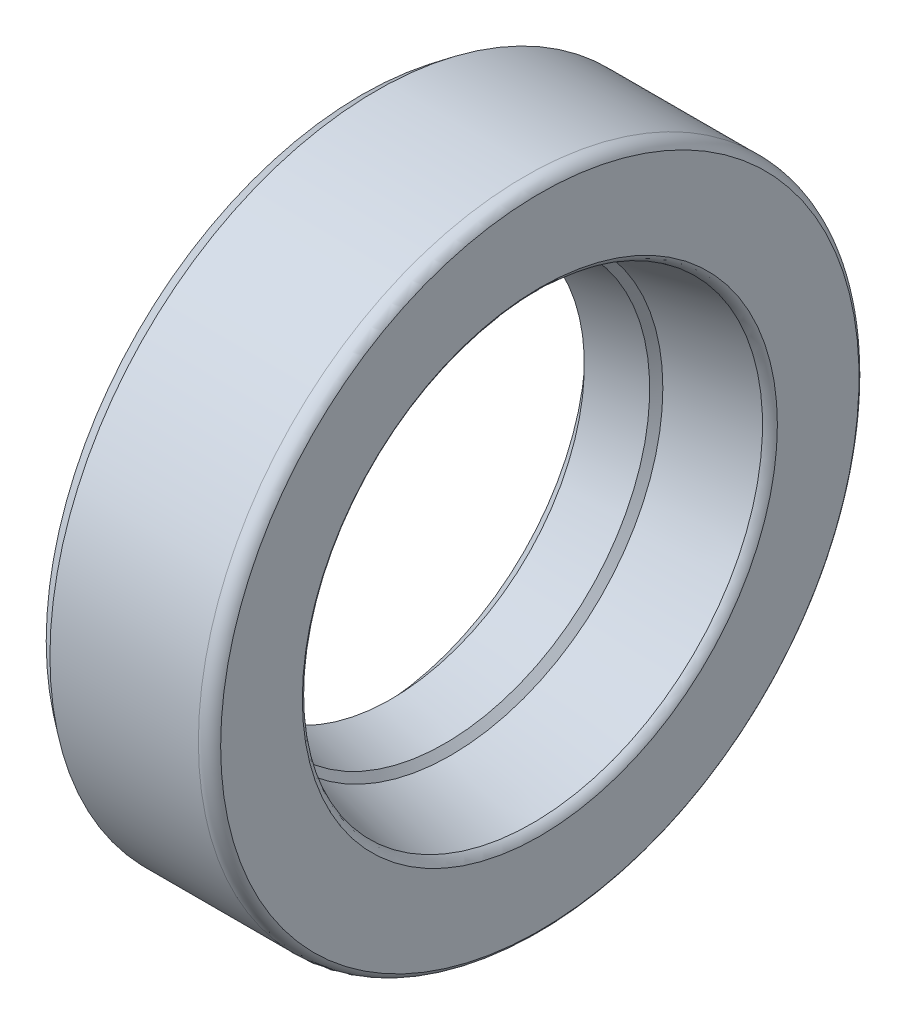
ISO-10303-21;
HEADER;
FILE_DESCRIPTION(('STEP AP214'),'2;1');
FILE_NAME('part.step','',(''),(''),'','','');
FILE_SCHEMA(('AUTOMOTIVE_DESIGN { 1 0 10303 214 1 1 1 1 }'));
ENDSEC;
DATA;
#1=APPLICATION_CONTEXT('core data for automotive mechanical design processes');
#2=APPLICATION_PROTOCOL_DEFINITION('international standard','automotive_design',2000,#1);
#3=PRODUCT_CONTEXT('',#1,'mechanical');
#4=PRODUCT('Part','Part','',(#3));
#5=PRODUCT_RELATED_PRODUCT_CATEGORY('part','',(#4));
#6=PRODUCT_DEFINITION_FORMATION('','',#4);
#7=PRODUCT_DEFINITION_CONTEXT('part definition',#1,'design');
#8=PRODUCT_DEFINITION('design','',#6,#7);
#9=PRODUCT_DEFINITION_SHAPE('','',#8);
#10=(LENGTH_UNIT() NAMED_UNIT(*) SI_UNIT(.MILLI.,.METRE.));
#11=(NAMED_UNIT(*) PLANE_ANGLE_UNIT() SI_UNIT($,.RADIAN.));
#12=(NAMED_UNIT(*) SI_UNIT($,.STERADIAN.) SOLID_ANGLE_UNIT());
#13=UNCERTAINTY_MEASURE_WITH_UNIT(LENGTH_MEASURE(1.E-05),#10,'distance_accuracy_value','');
#14=(GEOMETRIC_REPRESENTATION_CONTEXT(3) GLOBAL_UNCERTAINTY_ASSIGNED_CONTEXT((#13)) GLOBAL_UNIT_ASSIGNED_CONTEXT((#10,
#11,#12)) REPRESENTATION_CONTEXT('',''));
#15=CARTESIAN_POINT('',(0.,0.,0.));
#16=DIRECTION('',(0.,0.,1.));
#17=DIRECTION('',(1.,0.,0.));
#18=AXIS2_PLACEMENT_3D('',#15,#16,#17);
#19=CARTESIAN_POINT('',(0.,0.,0.));
#20=DIRECTION('',(-1.,0.,0.));
#21=DIRECTION('',(0.,0.,1.));
#22=AXIS2_PLACEMENT_3D('',#19,#20,#21);
#23=CYLINDRICAL_SURFACE('',#22,11.);
#24=CARTESIAN_POINT('',(5.5,0.,0.));
#25=DIRECTION('',(-1.,0.,0.));
#26=DIRECTION('',(0.,0.,1.));
#27=AXIS2_PLACEMENT_3D('',#24,#25,#26);
#28=CIRCLE('',#27,11.);
#29=CARTESIAN_POINT('',(5.5,0.,11.));
#30=VERTEX_POINT('',#29);
#31=EDGE_CURVE('E10',#30,#30,#28,.T.);
#32=ORIENTED_EDGE('',*,*,#31,.T.);
#33=EDGE_LOOP('',(#32));
#34=FACE_BOUND('',#33,.T.);
#35=CARTESIAN_POINT('',(0.5,0.,0.));
#36=DIRECTION('',(-1.,0.,0.));
#37=DIRECTION('',(0.,0.,1.));
#38=AXIS2_PLACEMENT_3D('',#35,#36,#37);
#39=CIRCLE('',#38,11.);
#40=CARTESIAN_POINT('',(0.5,0.,11.));
#41=VERTEX_POINT('',#40);
#42=EDGE_CURVE('E70',#41,#41,#39,.T.);
#43=ORIENTED_EDGE('',*,*,#42,.F.);
#44=EDGE_LOOP('',(#43));
#45=FACE_BOUND('',#44,.T.);
#46=ADVANCED_FACE('F15',(#34,#45),#23,.T.);
#47=CARTESIAN_POINT('',(5.56459503782261,0.,0.));
#48=DIRECTION('',(-1.,0.,0.));
#49=DIRECTION('',(0.,0.,1.));
#50=AXIS2_PLACEMENT_3D('',#47,#48,#49);
#51=TOROIDAL_SURFACE('',#50,10.5041900756452,0.5);
#52=ORIENTED_EDGE('',*,*,#31,.F.);
#53=EDGE_LOOP('',(#52));
#54=FACE_BOUND('',#53,.T.);
#55=CARTESIAN_POINT('',(6.,0.,0.));
#56=DIRECTION('',(-1.,0.,0.));
#57=DIRECTION('',(0.,0.,1.));
#58=AXIS2_PLACEMENT_3D('',#55,#56,#57);
#59=CIRCLE('',#58,10.75);
#60=CARTESIAN_POINT('',(6.,0.,10.75));
#61=VERTEX_POINT('',#60);
#62=EDGE_CURVE('E21',#61,#61,#59,.T.);
#63=ORIENTED_EDGE('',*,*,#62,.T.);
#64=EDGE_LOOP('',(#63));
#65=FACE_BOUND('',#64,.T.);
#66=ADVANCED_FACE('F78',(#54,#65),#51,.T.);
#67=CARTESIAN_POINT('',(6.,10.75,0.));
#68=DIRECTION('',(1.,0.,0.));
#69=DIRECTION('',(0.,0.,-1.));
#70=AXIS2_PLACEMENT_3D('',#67,#68,#69);
#71=PLANE('',#70);
#72=CARTESIAN_POINT('',(6.,0.,0.));
#73=DIRECTION('',(-1.,0.,0.));
#74=DIRECTION('',(0.,0.,1.));
#75=AXIS2_PLACEMENT_3D('',#72,#73,#74);
#76=CIRCLE('',#75,8.);
#77=CARTESIAN_POINT('',(6.,0.,8.));
#78=VERTEX_POINT('',#77);
#79=EDGE_CURVE('E25',#78,#78,#76,.T.);
#80=ORIENTED_EDGE('',*,*,#79,.T.);
#81=EDGE_LOOP('',(#80));
#82=FACE_BOUND('',#81,.T.);
#83=ORIENTED_EDGE('',*,*,#62,.F.);
#84=EDGE_LOOP('',(#83));
#85=FACE_BOUND('',#84,.T.);
#86=ADVANCED_FACE('F83',(#82,#85),#71,.T.);
#87=CARTESIAN_POINT('',(5.54428108611693,0.,0.));
#88=DIRECTION('',(-1.,0.,0.));
#89=DIRECTION('',(0.,0.,1.));
#90=AXIS2_PLACEMENT_3D('',#87,#88,#89);
#91=TOROIDAL_SURFACE('',#90,8.20571891388307,0.5);
#92=ORIENTED_EDGE('',*,*,#79,.F.);
#93=EDGE_LOOP('',(#92));
#94=FACE_BOUND('',#93,.T.);
#95=CARTESIAN_POINT('',(5.75,0.,0.));
#96=DIRECTION('',(-1.,0.,0.));
#97=DIRECTION('',(0.,0.,1.));
#98=AXIS2_PLACEMENT_3D('',#95,#96,#97);
#99=CIRCLE('',#98,7.75);
#100=CARTESIAN_POINT('',(5.75,0.,7.75));
#101=VERTEX_POINT('',#100);
#102=EDGE_CURVE('E29',#101,#101,#99,.T.);
#103=ORIENTED_EDGE('',*,*,#102,.T.);
#104=EDGE_LOOP('',(#103));
#105=FACE_BOUND('',#104,.T.);
#106=ADVANCED_FACE('F88',(#94,#105),#91,.T.);
#107=CARTESIAN_POINT('',(5.75,0.,0.));
#108=DIRECTION('',(1.,0.,0.));
#109=DIRECTION('',(0.,0.,-1.));
#110=AXIS2_PLACEMENT_3D('',#107,#108,#109);
#111=CONICAL_SURFACE('',#110,7.75,0.217293430923021);
#112=CARTESIAN_POINT('',(3.,0.,0.));
#113=DIRECTION('',(-1.,0.,0.));
#114=DIRECTION('',(0.,0.,1.));
#115=AXIS2_PLACEMENT_3D('',#112,#113,#114);
#116=CIRCLE('',#115,7.14285714285714);
#117=CARTESIAN_POINT('',(3.,0.,7.14285714285714));
#118=VERTEX_POINT('',#117);
#119=EDGE_CURVE('E34',#118,#118,#116,.T.);
#120=ORIENTED_EDGE('',*,*,#119,.T.);
#121=EDGE_LOOP('',(#120));
#122=FACE_BOUND('',#121,.T.);
#123=ORIENTED_EDGE('',*,*,#102,.F.);
#124=EDGE_LOOP('',(#123));
#125=FACE_BOUND('',#124,.T.);
#126=ADVANCED_FACE('F94',(#122,#125),#111,.F.);
#127=CARTESIAN_POINT('',(3.,0.,0.));
#128=DIRECTION('',(1.,0.,0.));
#129=DIRECTION('',(0.,0.,-1.));
#130=AXIS2_PLACEMENT_3D('',#127,#128,#129);
#131=CONICAL_SURFACE('',#130,7.14285714285714,0.881871938580034);
#132=CARTESIAN_POINT('',(2.8,0.,0.));
#133=DIRECTION('',(-1.,0.,0.));
#134=DIRECTION('',(0.,0.,1.));
#135=AXIS2_PLACEMENT_3D('',#132,#133,#134);
#136=CIRCLE('',#135,6.9);
#137=CARTESIAN_POINT('',(2.8,0.,6.9));
#138=VERTEX_POINT('',#137);
#139=EDGE_CURVE('E37',#138,#138,#136,.T.);
#140=ORIENTED_EDGE('',*,*,#139,.T.);
#141=EDGE_LOOP('',(#140));
#142=FACE_BOUND('',#141,.T.);
#143=ORIENTED_EDGE('',*,*,#119,.F.);
#144=EDGE_LOOP('',(#143));
#145=FACE_BOUND('',#144,.T.);
#146=ADVANCED_FACE('F98',(#142,#145),#131,.F.);
#147=CARTESIAN_POINT('',(2.8,0.,0.));
#148=DIRECTION('',(1.,0.,0.));
#149=DIRECTION('',(0.,0.,-1.));
#150=AXIS2_PLACEMENT_3D('',#147,#148,#149);
#151=CONICAL_SURFACE('',#150,6.9,0.218668945873942);
#152=CARTESIAN_POINT('',(1.,0.,0.));
#153=DIRECTION('',(-1.,0.,0.));
#154=DIRECTION('',(0.,0.,1.));
#155=AXIS2_PLACEMENT_3D('',#152,#153,#154);
#156=CIRCLE('',#155,6.5);
#157=CARTESIAN_POINT('',(1.,0.,6.5));
#158=VERTEX_POINT('',#157);
#159=EDGE_CURVE('E40',#158,#158,#156,.T.);
#160=ORIENTED_EDGE('',*,*,#159,.T.);
#161=EDGE_LOOP('',(#160));
#162=FACE_BOUND('',#161,.T.);
#163=ORIENTED_EDGE('',*,*,#139,.F.);
#164=EDGE_LOOP('',(#163));
#165=FACE_BOUND('',#164,.T.);
#166=ADVANCED_FACE('F102',(#162,#165),#151,.F.);
#167=CARTESIAN_POINT('',(1.,0.,0.));
#168=DIRECTION('',(-1.,0.,0.));
#169=DIRECTION('',(0.,0.,1.));
#170=AXIS2_PLACEMENT_3D('',#167,#168,#169);
#171=CONICAL_SURFACE('',#170,6.5,0.819867264396956);
#172=CARTESIAN_POINT('',(0.4,0.,0.));
#173=DIRECTION('',(-1.,0.,0.));
#174=DIRECTION('',(0.,0.,1.));
#175=AXIS2_PLACEMENT_3D('',#172,#173,#174);
#176=CIRCLE('',#175,7.14285714285714);
#177=CARTESIAN_POINT('',(0.4,0.,7.14285714285714));
#178=VERTEX_POINT('',#177);
#179=EDGE_CURVE('E43',#178,#178,#176,.T.);
#180=ORIENTED_EDGE('',*,*,#179,.T.);
#181=EDGE_LOOP('',(#180));
#182=FACE_BOUND('',#181,.T.);
#183=ORIENTED_EDGE('',*,*,#159,.F.);
#184=EDGE_LOOP('',(#183));
#185=FACE_BOUND('',#184,.T.);
#186=ADVANCED_FACE('F106',(#182,#185),#171,.F.);
#187=CARTESIAN_POINT('',(0.4,7.14285714285714,0.));
#188=DIRECTION('',(-1.,0.,0.));
#189=DIRECTION('',(0.,0.,1.));
#190=AXIS2_PLACEMENT_3D('',#187,#188,#189);
#191=PLANE('',#190);
#192=CARTESIAN_POINT('',(0.4,0.,0.));
#193=DIRECTION('',(-1.,0.,0.));
#194=DIRECTION('',(0.,0.,1.));
#195=AXIS2_PLACEMENT_3D('',#192,#193,#194);
#196=CIRCLE('',#195,8.2095671475545);
#197=CARTESIAN_POINT('',(0.4,0.,8.2095671475545));
#198=VERTEX_POINT('',#197);
#199=EDGE_CURVE('E46',#198,#198,#196,.T.);
#200=ORIENTED_EDGE('',*,*,#199,.T.);
#201=EDGE_LOOP('',(#200));
#202=FACE_BOUND('',#201,.T.);
#203=ORIENTED_EDGE('',*,*,#179,.F.);
#204=EDGE_LOOP('',(#203));
#205=FACE_BOUND('',#204,.T.);
#206=ADVANCED_FACE('F110',(#202,#205),#191,.T.);
#207=CARTESIAN_POINT('',(0.,0.,0.));
#208=DIRECTION('',(-1.,0.,0.));
#209=DIRECTION('',(0.,0.,1.));
#210=AXIS2_PLACEMENT_3D('',#207,#208,#209);
#211=CYLINDRICAL_SURFACE('',#210,8.2095671475545);
#212=CARTESIAN_POINT('',(1.21688120867735,0.,0.));
#213=DIRECTION('',(-1.,0.,0.));
#214=DIRECTION('',(0.,0.,1.));
#215=AXIS2_PLACEMENT_3D('',#212,#213,#214);
#216=CIRCLE('',#215,8.2095671475545);
#217=CARTESIAN_POINT('',(1.21688120867735,0.,8.2095671475545));
#218=VERTEX_POINT('',#217);
#219=EDGE_CURVE('E49',#218,#218,#216,.T.);
#220=ORIENTED_EDGE('',*,*,#219,.T.);
#221=EDGE_LOOP('',(#220));
#222=FACE_BOUND('',#221,.T.);
#223=ORIENTED_EDGE('',*,*,#199,.F.);
#224=EDGE_LOOP('',(#223));
#225=FACE_BOUND('',#224,.T.);
#226=ADVANCED_FACE('F114',(#222,#225),#211,.T.);
#227=CARTESIAN_POINT('',(1.5,0.,0.));
#228=DIRECTION('',(-1.,0.,0.));
#229=DIRECTION('',(0.,0.,1.));
#230=AXIS2_PLACEMENT_3D('',#227,#228,#229);
#231=TOROIDAL_SURFACE('',#230,7.625,0.649519052838329);
#232=ORIENTED_EDGE('',*,*,#219,.F.);
#233=EDGE_LOOP('',(#232));
#234=FACE_BOUND('',#233,.T.);
#235=CARTESIAN_POINT('',(2.1394044664322,0.,0.));
#236=DIRECTION('',(-1.,0.,0.));
#237=DIRECTION('',(0.,0.,1.));
#238=AXIS2_PLACEMENT_3D('',#235,#236,#237);
#239=CIRCLE('',#238,7.73917936900575);
#240=CARTESIAN_POINT('',(2.1394044664322,0.,7.73917936900575));
#241=VERTEX_POINT('',#240);
#242=EDGE_CURVE('E52',#241,#241,#239,.T.);
#243=ORIENTED_EDGE('',*,*,#242,.T.);
#244=EDGE_LOOP('',(#243));
#245=FACE_BOUND('',#244,.T.);
#246=ADVANCED_FACE('F118',(#234,#245),#231,.T.);
#247=CARTESIAN_POINT('',(3.6,0.,0.));
#248=DIRECTION('',(1.,0.,0.));
#249=DIRECTION('',(0.,0.,-1.));
#250=AXIS2_PLACEMENT_3D('',#247,#248,#249);
#251=CONICAL_SURFACE('',#250,8.,0.176708856070036);
#252=ORIENTED_EDGE('',*,*,#242,.F.);
#253=EDGE_LOOP('',(#252));
#254=FACE_BOUND('',#253,.T.);
#255=CARTESIAN_POINT('',(3.6,0.,0.));
#256=DIRECTION('',(-1.,0.,0.));
#257=DIRECTION('',(0.,0.,1.));
#258=AXIS2_PLACEMENT_3D('',#255,#256,#257);
#259=CIRCLE('',#258,8.);
#260=CARTESIAN_POINT('',(3.6,0.,8.));
#261=VERTEX_POINT('',#260);
#262=EDGE_CURVE('E55',#261,#261,#259,.T.);
#263=ORIENTED_EDGE('',*,*,#262,.T.);
#264=EDGE_LOOP('',(#263));
#265=FACE_BOUND('',#264,.T.);
#266=ADVANCED_FACE('F122',(#254,#265),#251,.T.);
#267=CARTESIAN_POINT('',(3.6,9.625,0.));
#268=DIRECTION('',(1.,0.,0.));
#269=DIRECTION('',(0.,0.,-1.));
#270=AXIS2_PLACEMENT_3D('',#267,#268,#269);
#271=PLANE('',#270);
#272=ORIENTED_EDGE('',*,*,#262,.F.);
#273=EDGE_LOOP('',(#272));
#274=FACE_BOUND('',#273,.T.);
#275=CARTESIAN_POINT('',(3.6,0.,0.));
#276=DIRECTION('',(-1.,0.,0.));
#277=DIRECTION('',(0.,0.,1.));
#278=AXIS2_PLACEMENT_3D('',#275,#276,#277);
#279=CIRCLE('',#278,9.625);
#280=CARTESIAN_POINT('',(3.6,0.,9.625));
#281=VERTEX_POINT('',#280);
#282=EDGE_CURVE('E58',#281,#281,#279,.T.);
#283=ORIENTED_EDGE('',*,*,#282,.T.);
#284=EDGE_LOOP('',(#283));
#285=FACE_BOUND('',#284,.T.);
#286=ADVANCED_FACE('F126',(#274,#285),#271,.F.);
#287=CARTESIAN_POINT('',(3.14428108611693,0.,0.));
#288=DIRECTION('',(-1.,0.,0.));
#289=DIRECTION('',(0.,0.,1.));
#290=AXIS2_PLACEMENT_3D('',#287,#288,#289);
#291=TOROIDAL_SURFACE('',#290,9.41928108611693,0.5);
#292=CARTESIAN_POINT('',(3.35,0.,0.));
#293=DIRECTION('',(-1.,0.,0.));
#294=DIRECTION('',(0.,0.,1.));
#295=AXIS2_PLACEMENT_3D('',#292,#293,#294);
#296=CIRCLE('',#295,9.875);
#297=CARTESIAN_POINT('',(3.35,0.,9.875));
#298=VERTEX_POINT('',#297);
#299=EDGE_CURVE('E61',#298,#298,#296,.T.);
#300=ORIENTED_EDGE('',*,*,#299,.T.);
#301=EDGE_LOOP('',(#300));
#302=FACE_BOUND('',#301,.T.);
#303=ORIENTED_EDGE('',*,*,#282,.F.);
#304=EDGE_LOOP('',(#303));
#305=FACE_BOUND('',#304,.T.);
#306=ADVANCED_FACE('F130',(#302,#305),#291,.F.);
#307=CARTESIAN_POINT('',(0.,0.,0.));
#308=DIRECTION('',(-1.,0.,0.));
#309=DIRECTION('',(0.,0.,1.));
#310=AXIS2_PLACEMENT_3D('',#307,#308,#309);
#311=CONICAL_SURFACE('',#310,10.1,0.067063458435669);
#312=ORIENTED_EDGE('',*,*,#299,.F.);
#313=EDGE_LOOP('',(#312));
#314=FACE_BOUND('',#313,.T.);
#315=CARTESIAN_POINT('',(0.,0.,0.));
#316=DIRECTION('',(-1.,0.,0.));
#317=DIRECTION('',(0.,0.,1.));
#318=AXIS2_PLACEMENT_3D('',#315,#316,#317);
#319=CIRCLE('',#318,10.1);
#320=CARTESIAN_POINT('',(0.,0.,10.1));
#321=VERTEX_POINT('',#320);
#322=EDGE_CURVE('E64',#321,#321,#319,.T.);
#323=ORIENTED_EDGE('',*,*,#322,.T.);
#324=EDGE_LOOP('',(#323));
#325=FACE_BOUND('',#324,.T.);
#326=ADVANCED_FACE('F134',(#314,#325),#311,.F.);
#327=CARTESIAN_POINT('',(0.,10.1,0.));
#328=DIRECTION('',(-1.,0.,0.));
#329=DIRECTION('',(0.,0.,1.));
#330=AXIS2_PLACEMENT_3D('',#327,#328,#329);
#331=PLANE('',#330);
#332=CARTESIAN_POINT('',(0.,0.,0.));
#333=DIRECTION('',(-1.,0.,0.));
#334=DIRECTION('',(0.,0.,1.));
#335=AXIS2_PLACEMENT_3D('',#332,#333,#334);
#336=CIRCLE('',#335,10.625);
#337=CARTESIAN_POINT('',(0.,0.,10.625));
#338=VERTEX_POINT('',#337);
#339=EDGE_CURVE('E67',#338,#338,#336,.T.);
#340=ORIENTED_EDGE('',*,*,#339,.T.);
#341=EDGE_LOOP('',(#340));
#342=FACE_BOUND('',#341,.T.);
#343=ORIENTED_EDGE('',*,*,#322,.F.);
#344=EDGE_LOOP('',(#343));
#345=FACE_BOUND('',#344,.T.);
#346=ADVANCED_FACE('F138',(#342,#345),#331,.T.);
#347=CARTESIAN_POINT('',(0.,0.,0.));
#348=DIRECTION('',(1.,0.,0.));
#349=DIRECTION('',(0.,0.,-1.));
#350=AXIS2_PLACEMENT_3D('',#347,#348,#349);
#351=CONICAL_SURFACE('',#350,10.625,0.643501108793284);
#352=ORIENTED_EDGE('',*,*,#42,.T.);
#353=EDGE_LOOP('',(#352));
#354=FACE_BOUND('',#353,.T.);
#355=ORIENTED_EDGE('',*,*,#339,.F.);
#356=EDGE_LOOP('',(#355));
#357=FACE_BOUND('',#356,.T.);
#358=ADVANCED_FACE('F74',(#354,#357),#351,.T.);
#359=CLOSED_SHELL('',(#46,#66,#86,#106,#126,#146,#166,#186,#206,#226,#246,#266,#286,#306,#326,
#346,#358));
#360=MANIFOLD_SOLID_BREP('B1',#359);
#361=ADVANCED_BREP_SHAPE_REPRESENTATION('',(#18,#360),#14);
#362=SHAPE_DEFINITION_REPRESENTATION(#9,#361);
ENDSEC;
END-ISO-10303-21;
